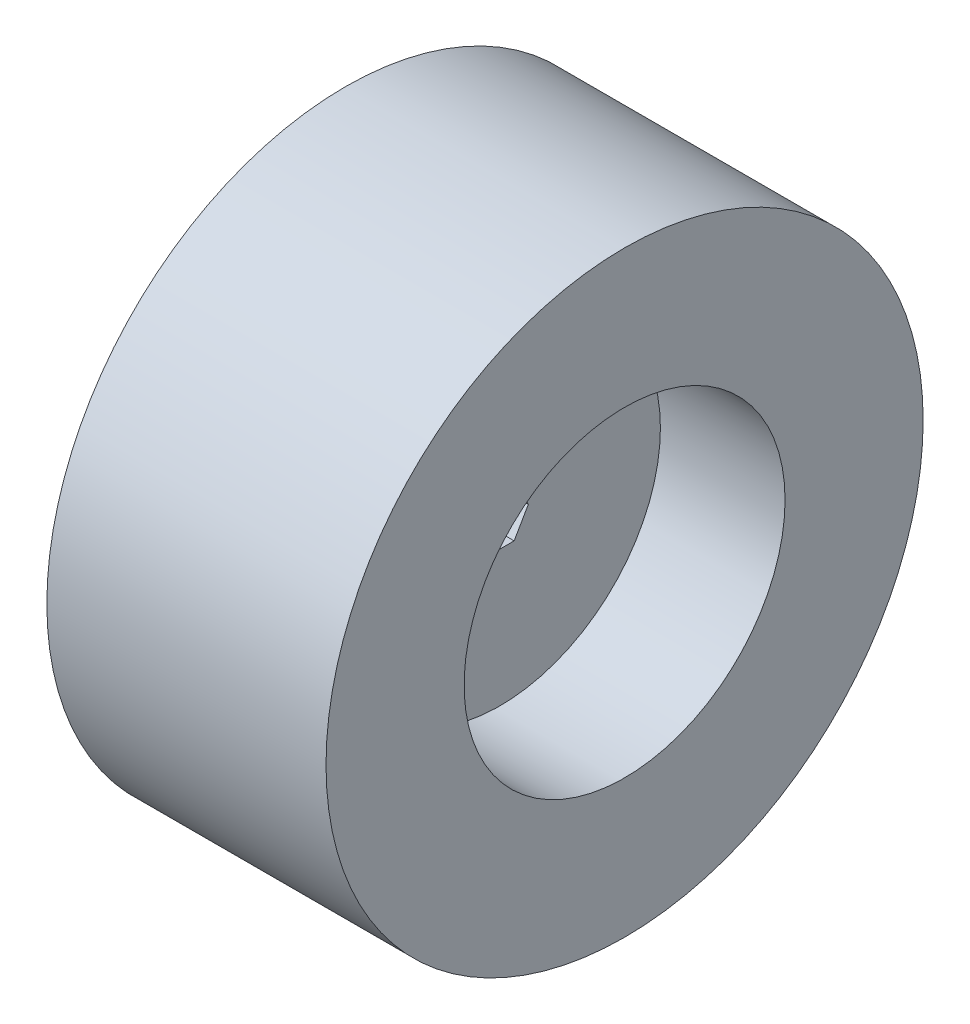
ISO-10303-21;
HEADER;
FILE_DESCRIPTION(('STEP AP214'),'2;1');
FILE_NAME('part.step','',(''),(''),'','','');
FILE_SCHEMA(('AUTOMOTIVE_DESIGN { 1 0 10303 214 1 1 1 1 }'));
ENDSEC;
DATA;
#1=APPLICATION_CONTEXT('core data for automotive mechanical design processes');
#2=APPLICATION_PROTOCOL_DEFINITION('international standard','automotive_design',2000,#1);
#3=PRODUCT_CONTEXT('',#1,'mechanical');
#4=PRODUCT('Part','Part','',(#3));
#5=PRODUCT_RELATED_PRODUCT_CATEGORY('part','',(#4));
#6=PRODUCT_DEFINITION_FORMATION('','',#4);
#7=PRODUCT_DEFINITION_CONTEXT('part definition',#1,'design');
#8=PRODUCT_DEFINITION('design','',#6,#7);
#9=PRODUCT_DEFINITION_SHAPE('','',#8);
#10=(LENGTH_UNIT() NAMED_UNIT(*) SI_UNIT(.MILLI.,.METRE.));
#11=(NAMED_UNIT(*) PLANE_ANGLE_UNIT() SI_UNIT($,.RADIAN.));
#12=(NAMED_UNIT(*) SI_UNIT($,.STERADIAN.) SOLID_ANGLE_UNIT());
#13=UNCERTAINTY_MEASURE_WITH_UNIT(LENGTH_MEASURE(1.E-05),#10,'distance_accuracy_value','');
#14=(GEOMETRIC_REPRESENTATION_CONTEXT(3) GLOBAL_UNCERTAINTY_ASSIGNED_CONTEXT((#13)) GLOBAL_UNIT_ASSIGNED_CONTEXT((#10,
#11,#12)) REPRESENTATION_CONTEXT('',''));
#15=CARTESIAN_POINT('',(0.,0.,0.));
#16=DIRECTION('',(0.,0.,1.));
#17=DIRECTION('',(1.,0.,0.));
#18=AXIS2_PLACEMENT_3D('',#15,#16,#17);
#19=CARTESIAN_POINT('',(37.4,0.,0.));
#20=DIRECTION('',(-1.,0.,0.));
#21=DIRECTION('',(0.,0.,1.));
#22=AXIS2_PLACEMENT_3D('',#19,#20,#21);
#23=CYLINDRICAL_SURFACE('',#22,21.5);
#24=CARTESIAN_POINT('',(20.7,0.,0.));
#25=DIRECTION('',(1.,0.,0.));
#26=DIRECTION('',(0.,0.,-1.));
#27=AXIS2_PLACEMENT_3D('',#24,#25,#26);
#28=CIRCLE('',#27,21.5);
#29=CARTESIAN_POINT('',(20.7,0.,-21.5));
#30=VERTEX_POINT('',#29);
#31=EDGE_CURVE('E11',#30,#30,#28,.T.);
#32=ORIENTED_EDGE('',*,*,#31,.F.);
#33=EDGE_LOOP('',(#32));
#34=FACE_BOUND('',#33,.T.);
#35=CARTESIAN_POINT('',(37.4,0.,0.));
#36=DIRECTION('',(1.,0.,0.));
#37=DIRECTION('',(0.,0.,-1.));
#38=AXIS2_PLACEMENT_3D('',#35,#36,#37);
#39=CIRCLE('',#38,21.5);
#40=CARTESIAN_POINT('',(37.4,0.,-21.5));
#41=VERTEX_POINT('',#40);
#42=EDGE_CURVE('E173',#41,#41,#39,.T.);
#43=ORIENTED_EDGE('',*,*,#42,.T.);
#44=EDGE_LOOP('',(#43));
#45=FACE_BOUND('',#44,.T.);
#46=ADVANCED_FACE('F43',(#34,#45),#23,.F.);
#47=CARTESIAN_POINT('',(37.4,0.,0.));
#48=DIRECTION('',(-1.,0.,0.));
#49=DIRECTION('',(0.,0.,1.));
#50=AXIS2_PLACEMENT_3D('',#47,#48,#49);
#51=CYLINDRICAL_SURFACE('',#50,40.);
#52=CARTESIAN_POINT('',(37.4,0.,0.));
#53=DIRECTION('',(1.,0.,0.));
#54=DIRECTION('',(0.,0.,-1.));
#55=AXIS2_PLACEMENT_3D('',#52,#53,#54);
#56=CIRCLE('',#55,40.);
#57=CARTESIAN_POINT('',(37.4,0.,-40.));
#58=VERTEX_POINT('',#57);
#59=EDGE_CURVE('E51',#58,#58,#56,.T.);
#60=ORIENTED_EDGE('',*,*,#59,.F.);
#61=EDGE_LOOP('',(#60));
#62=FACE_BOUND('',#61,.T.);
#63=CARTESIAN_POINT('',(0.,0.,0.));
#64=DIRECTION('',(1.,0.,0.));
#65=DIRECTION('',(0.,0.,-1.));
#66=AXIS2_PLACEMENT_3D('',#63,#64,#65);
#67=CIRCLE('',#66,40.);
#68=CARTESIAN_POINT('',(0.,0.,-40.));
#69=VERTEX_POINT('',#68);
#70=EDGE_CURVE('E172',#69,#69,#67,.T.);
#71=ORIENTED_EDGE('',*,*,#70,.T.);
#72=EDGE_LOOP('',(#71));
#73=FACE_BOUND('',#72,.T.);
#74=ADVANCED_FACE('F183',(#62,#73),#51,.T.);
#75=CARTESIAN_POINT('',(37.4,0.,0.));
#76=DIRECTION('',(1.,0.,0.));
#77=DIRECTION('',(0.,0.,-1.));
#78=AXIS2_PLACEMENT_3D('',#75,#76,#77);
#79=PLANE('',#78);
#80=ORIENTED_EDGE('',*,*,#42,.F.);
#81=EDGE_LOOP('',(#80));
#82=FACE_BOUND('',#81,.T.);
#83=ORIENTED_EDGE('',*,*,#59,.T.);
#84=EDGE_LOOP('',(#83));
#85=FACE_BOUND('',#84,.T.);
#86=ADVANCED_FACE('F189',(#82,#85),#79,.T.);
#87=CARTESIAN_POINT('',(0.,0.,0.));
#88=DIRECTION('',(1.,0.,0.));
#89=DIRECTION('',(0.,0.,-1.));
#90=AXIS2_PLACEMENT_3D('',#87,#88,#89);
#91=PLANE('',#90);
#92=ORIENTED_EDGE('',*,*,#70,.F.);
#93=EDGE_LOOP('',(#92));
#94=FACE_BOUND('',#93,.T.);
#95=CARTESIAN_POINT('',(0.,0.,0.));
#96=DIRECTION('',(1.,0.,0.));
#97=DIRECTION('',(0.,0.,-1.));
#98=AXIS2_PLACEMENT_3D('',#95,#96,#97);
#99=CIRCLE('',#98,1.5);
#100=CARTESIAN_POINT('',(0.,0.,-1.5));
#101=VERTEX_POINT('',#100);
#102=EDGE_CURVE('E133',#101,#101,#99,.T.);
#103=ORIENTED_EDGE('',*,*,#102,.T.);
#104=EDGE_LOOP('',(#103));
#105=FACE_BOUND('',#104,.T.);
#106=ADVANCED_FACE('F185',(#94,#105),#91,.F.);
#107=CARTESIAN_POINT('',(20.7,-1.64977839420935,-2.8575));
#108=DIRECTION('',(0.,0.5,0.866025403784439));
#109=DIRECTION('',(0.,-0.866025403784439,0.5));
#110=AXIS2_PLACEMENT_3D('',#107,#108,#109);
#111=PLANE('',#110);
#112=DIRECTION('',(0.,0.866025403784439,-0.5));
#113=VECTOR('',#112,1.);
#114=CARTESIAN_POINT('',(10.45,-1.64977839420935,-2.8575));
#115=LINE('',#114,#113);
#116=CARTESIAN_POINT('',(10.45,-3.29955678841871,-1.905));
#117=VERTEX_POINT('',#116);
#118=CARTESIAN_POINT('',(10.45,0.,-3.81));
#119=VERTEX_POINT('',#118);
#120=EDGE_CURVE('E58',#117,#119,#115,.T.);
#121=ORIENTED_EDGE('',*,*,#120,.F.);
#122=DIRECTION('',(-1.,0.,0.));
#123=VECTOR('',#122,1.);
#124=CARTESIAN_POINT('',(20.7,-3.29955678841871,-1.905));
#125=LINE('',#124,#123);
#126=CARTESIAN_POINT('',(20.7,-3.29955678841871,-1.905));
#127=VERTEX_POINT('',#126);
#128=EDGE_CURVE('E169',#127,#117,#125,.T.);
#129=ORIENTED_EDGE('',*,*,#128,.F.);
#130=DIRECTION('',(0.,0.866025403784439,-0.5));
#131=VECTOR('',#130,1.);
#132=CARTESIAN_POINT('',(20.7,-1.64977839420935,-2.8575));
#133=LINE('',#132,#131);
#134=CARTESIAN_POINT('',(20.7,0.,-3.81));
#135=VERTEX_POINT('',#134);
#136=EDGE_CURVE('E132',#127,#135,#133,.T.);
#137=ORIENTED_EDGE('',*,*,#136,.T.);
#138=DIRECTION('',(-1.,0.,0.));
#139=VECTOR('',#138,1.);
#140=CARTESIAN_POINT('',(20.7,0.,-3.81));
#141=LINE('',#140,#139);
#142=EDGE_CURVE('E108',#135,#119,#141,.T.);
#143=ORIENTED_EDGE('',*,*,#142,.T.);
#144=EDGE_LOOP('',(#121,#129,#137,#143));
#145=FACE_BOUND('',#144,.T.);
#146=ADVANCED_FACE('F188',(#145),#111,.T.);
#147=CARTESIAN_POINT('',(20.7,-3.29955678841871,0.));
#148=DIRECTION('',(0.,1.,0.));
#149=DIRECTION('',(0.,0.,1.));
#150=AXIS2_PLACEMENT_3D('',#147,#148,#149);
#151=PLANE('',#150);
#152=DIRECTION('',(0.,0.,-1.));
#153=VECTOR('',#152,1.);
#154=CARTESIAN_POINT('',(10.45,-3.29955678841871,0.));
#155=LINE('',#154,#153);
#156=CARTESIAN_POINT('',(10.45,-3.29955678841871,1.905));
#157=VERTEX_POINT('',#156);
#158=EDGE_CURVE('E65',#157,#117,#155,.T.);
#159=ORIENTED_EDGE('',*,*,#158,.F.);
#160=DIRECTION('',(-1.,0.,0.));
#161=VECTOR('',#160,1.);
#162=CARTESIAN_POINT('',(20.7,-3.29955678841871,1.905));
#163=LINE('',#162,#161);
#164=CARTESIAN_POINT('',(20.7,-3.29955678841871,1.905));
#165=VERTEX_POINT('',#164);
#166=EDGE_CURVE('E166',#165,#157,#163,.T.);
#167=ORIENTED_EDGE('',*,*,#166,.F.);
#168=DIRECTION('',(0.,0.,-1.));
#169=VECTOR('',#168,1.);
#170=CARTESIAN_POINT('',(20.7,-3.29955678841871,0.));
#171=LINE('',#170,#169);
#172=EDGE_CURVE('E141',#165,#127,#171,.T.);
#173=ORIENTED_EDGE('',*,*,#172,.T.);
#174=ORIENTED_EDGE('',*,*,#128,.T.);
#175=EDGE_LOOP('',(#159,#167,#173,#174));
#176=FACE_BOUND('',#175,.T.);
#177=ADVANCED_FACE('F226',(#176),#151,.T.);
#178=CARTESIAN_POINT('',(20.7,-1.64977839420936,2.8575));
#179=DIRECTION('',(0.,0.5,-0.866025403784439));
#180=DIRECTION('',(0.,0.866025403784439,0.5));
#181=AXIS2_PLACEMENT_3D('',#178,#179,#180);
#182=PLANE('',#181);
#183=DIRECTION('',(0.,-0.866025403784439,-0.5));
#184=VECTOR('',#183,1.);
#185=CARTESIAN_POINT('',(10.45,-1.64977839420936,2.8575));
#186=LINE('',#185,#184);
#187=CARTESIAN_POINT('',(10.45,0.,3.81));
#188=VERTEX_POINT('',#187);
#189=EDGE_CURVE('E128',#188,#157,#186,.T.);
#190=ORIENTED_EDGE('',*,*,#189,.F.);
#191=DIRECTION('',(-1.,0.,0.));
#192=VECTOR('',#191,1.);
#193=CARTESIAN_POINT('',(20.7,0.,3.81));
#194=LINE('',#193,#192);
#195=CARTESIAN_POINT('',(20.7,0.,3.81));
#196=VERTEX_POINT('',#195);
#197=EDGE_CURVE('E162',#196,#188,#194,.T.);
#198=ORIENTED_EDGE('',*,*,#197,.F.);
#199=DIRECTION('',(0.,-0.866025403784439,-0.5));
#200=VECTOR('',#199,1.);
#201=CARTESIAN_POINT('',(20.7,-1.64977839420936,2.8575));
#202=LINE('',#201,#200);
#203=EDGE_CURVE('E145',#196,#165,#202,.T.);
#204=ORIENTED_EDGE('',*,*,#203,.T.);
#205=ORIENTED_EDGE('',*,*,#166,.T.);
#206=EDGE_LOOP('',(#190,#198,#204,#205));
#207=FACE_BOUND('',#206,.T.);
#208=ADVANCED_FACE('F229',(#207),#182,.T.);
#209=CARTESIAN_POINT('',(20.7,1.64977839420936,2.8575));
#210=DIRECTION('',(0.,-0.5,-0.866025403784439));
#211=DIRECTION('',(0.,0.866025403784439,-0.5));
#212=AXIS2_PLACEMENT_3D('',#209,#210,#211);
#213=PLANE('',#212);
#214=DIRECTION('',(0.,-0.866025403784439,0.5));
#215=VECTOR('',#214,1.);
#216=CARTESIAN_POINT('',(10.45,1.64977839420936,2.8575));
#217=LINE('',#216,#215);
#218=CARTESIAN_POINT('',(10.45,3.29955678841871,1.905));
#219=VERTEX_POINT('',#218);
#220=EDGE_CURVE('E117',#219,#188,#217,.T.);
#221=ORIENTED_EDGE('',*,*,#220,.F.);
#222=DIRECTION('',(-1.,0.,0.));
#223=VECTOR('',#222,1.);
#224=CARTESIAN_POINT('',(20.7,3.29955678841871,1.905));
#225=LINE('',#224,#223);
#226=CARTESIAN_POINT('',(20.7,3.29955678841871,1.905));
#227=VERTEX_POINT('',#226);
#228=EDGE_CURVE('E107',#227,#219,#225,.T.);
#229=ORIENTED_EDGE('',*,*,#228,.F.);
#230=DIRECTION('',(0.,-0.866025403784439,0.5));
#231=VECTOR('',#230,1.);
#232=CARTESIAN_POINT('',(20.7,1.64977839420936,2.8575));
#233=LINE('',#232,#231);
#234=EDGE_CURVE('E149',#227,#196,#233,.T.);
#235=ORIENTED_EDGE('',*,*,#234,.T.);
#236=ORIENTED_EDGE('',*,*,#197,.T.);
#237=EDGE_LOOP('',(#221,#229,#235,#236));
#238=FACE_BOUND('',#237,.T.);
#239=ADVANCED_FACE('F232',(#238),#213,.T.);
#240=CARTESIAN_POINT('',(20.7,3.29955678841871,0.));
#241=DIRECTION('',(0.,-1.,0.));
#242=DIRECTION('',(0.,0.,-1.));
#243=AXIS2_PLACEMENT_3D('',#240,#241,#242);
#244=PLANE('',#243);
#245=DIRECTION('',(0.,0.,1.));
#246=VECTOR('',#245,1.);
#247=CARTESIAN_POINT('',(10.45,3.29955678841871,0.));
#248=LINE('',#247,#246);
#249=CARTESIAN_POINT('',(10.45,3.29955678841871,-1.905));
#250=VERTEX_POINT('',#249);
#251=EDGE_CURVE('E112',#250,#219,#248,.T.);
#252=ORIENTED_EDGE('',*,*,#251,.F.);
#253=DIRECTION('',(-1.,0.,0.));
#254=VECTOR('',#253,1.);
#255=CARTESIAN_POINT('',(20.7,3.29955678841871,-1.905));
#256=LINE('',#255,#254);
#257=CARTESIAN_POINT('',(20.7,3.29955678841871,-1.905));
#258=VERTEX_POINT('',#257);
#259=EDGE_CURVE('E96',#258,#250,#256,.T.);
#260=ORIENTED_EDGE('',*,*,#259,.F.);
#261=DIRECTION('',(0.,0.,1.));
#262=VECTOR('',#261,1.);
#263=CARTESIAN_POINT('',(20.7,3.29955678841871,0.));
#264=LINE('',#263,#262);
#265=EDGE_CURVE('E153',#258,#227,#264,.T.);
#266=ORIENTED_EDGE('',*,*,#265,.T.);
#267=ORIENTED_EDGE('',*,*,#228,.T.);
#268=EDGE_LOOP('',(#252,#260,#266,#267));
#269=FACE_BOUND('',#268,.T.);
#270=ADVANCED_FACE('F113',(#269),#244,.T.);
#271=CARTESIAN_POINT('',(20.7,1.64977839420936,-2.8575));
#272=DIRECTION('',(0.,-0.5,0.866025403784439));
#273=DIRECTION('',(0.,-0.866025403784439,-0.5));
#274=AXIS2_PLACEMENT_3D('',#271,#272,#273);
#275=PLANE('',#274);
#276=DIRECTION('',(0.,0.866025403784439,0.5));
#277=VECTOR('',#276,1.);
#278=CARTESIAN_POINT('',(10.45,1.64977839420936,-2.8575));
#279=LINE('',#278,#277);
#280=EDGE_CURVE('E100',#119,#250,#279,.T.);
#281=ORIENTED_EDGE('',*,*,#280,.F.);
#282=ORIENTED_EDGE('',*,*,#142,.F.);
#283=DIRECTION('',(0.,0.866025403784439,0.5));
#284=VECTOR('',#283,1.);
#285=CARTESIAN_POINT('',(20.7,1.64977839420936,-2.8575));
#286=LINE('',#285,#284);
#287=EDGE_CURVE('E102',#135,#258,#286,.T.);
#288=ORIENTED_EDGE('',*,*,#287,.T.);
#289=ORIENTED_EDGE('',*,*,#259,.T.);
#290=EDGE_LOOP('',(#281,#282,#288,#289));
#291=FACE_BOUND('',#290,.T.);
#292=ADVANCED_FACE('F98',(#291),#275,.T.);
#293=CARTESIAN_POINT('',(20.7,0.,0.));
#294=DIRECTION('',(1.,0.,0.));
#295=DIRECTION('',(0.,0.,-1.));
#296=AXIS2_PLACEMENT_3D('',#293,#294,#295);
#297=PLANE('',#296);
#298=ORIENTED_EDGE('',*,*,#136,.F.);
#299=ORIENTED_EDGE('',*,*,#172,.F.);
#300=ORIENTED_EDGE('',*,*,#203,.F.);
#301=ORIENTED_EDGE('',*,*,#234,.F.);
#302=ORIENTED_EDGE('',*,*,#265,.F.);
#303=ORIENTED_EDGE('',*,*,#287,.F.);
#304=EDGE_LOOP('',(#298,#299,#300,#301,#302,#303));
#305=FACE_BOUND('',#304,.T.);
#306=ORIENTED_EDGE('',*,*,#31,.T.);
#307=EDGE_LOOP('',(#306));
#308=FACE_BOUND('',#307,.T.);
#309=ADVANCED_FACE('F195',(#305,#308),#297,.T.);
#310=CARTESIAN_POINT('',(10.45,0.,0.));
#311=DIRECTION('',(-1.,0.,0.));
#312=DIRECTION('',(0.,0.,1.));
#313=AXIS2_PLACEMENT_3D('',#310,#311,#312);
#314=CYLINDRICAL_SURFACE('',#313,1.5);
#315=CARTESIAN_POINT('',(10.45,0.,0.));
#316=DIRECTION('',(1.,0.,0.));
#317=DIRECTION('',(0.,0.,-1.));
#318=AXIS2_PLACEMENT_3D('',#315,#316,#317);
#319=CIRCLE('',#318,1.5);
#320=CARTESIAN_POINT('',(10.45,0.,-1.5));
#321=VERTEX_POINT('',#320);
#322=EDGE_CURVE('E137',#321,#321,#319,.T.);
#323=ORIENTED_EDGE('',*,*,#322,.T.);
#324=EDGE_LOOP('',(#323));
#325=FACE_BOUND('',#324,.T.);
#326=ORIENTED_EDGE('',*,*,#102,.F.);
#327=EDGE_LOOP('',(#326));
#328=FACE_BOUND('',#327,.T.);
#329=ADVANCED_FACE('F193',(#325,#328),#314,.F.);
#330=CARTESIAN_POINT('',(10.45,0.,0.));
#331=DIRECTION('',(1.,0.,0.));
#332=DIRECTION('',(0.,0.,-1.));
#333=AXIS2_PLACEMENT_3D('',#330,#331,#332);
#334=PLANE('',#333);
#335=ORIENTED_EDGE('',*,*,#322,.F.);
#336=EDGE_LOOP('',(#335));
#337=FACE_BOUND('',#336,.T.);
#338=ORIENTED_EDGE('',*,*,#158,.T.);
#339=ORIENTED_EDGE('',*,*,#120,.T.);
#340=ORIENTED_EDGE('',*,*,#280,.T.);
#341=ORIENTED_EDGE('',*,*,#251,.T.);
#342=ORIENTED_EDGE('',*,*,#220,.T.);
#343=ORIENTED_EDGE('',*,*,#189,.T.);
#344=EDGE_LOOP('',(#338,#339,#340,#341,#342,#343));
#345=FACE_BOUND('',#344,.T.);
#346=ADVANCED_FACE('F119',(#337,#345),#334,.T.);
#347=CLOSED_SHELL('',(#46,#74,#86,#106,#146,#177,#208,#239,#270,#292,#309,#329,#346));
#348=MANIFOLD_SOLID_BREP('B2',#347);
#349=ADVANCED_BREP_SHAPE_REPRESENTATION('',(#18,#348),#14);
#350=SHAPE_DEFINITION_REPRESENTATION(#9,#349);
ENDSEC;
END-ISO-10303-21;
